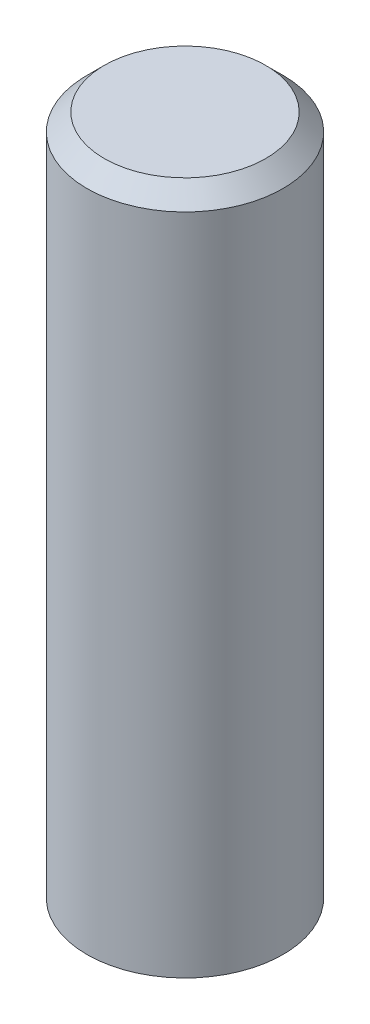
ISO-10303-21;
HEADER;
FILE_DESCRIPTION(('STEP AP214'),'2;1');
FILE_NAME('part.step','',(''),(''),'','','');
FILE_SCHEMA(('AUTOMOTIVE_DESIGN { 1 0 10303 214 1 1 1 1 }'));
ENDSEC;
DATA;
#1=APPLICATION_CONTEXT('core data for automotive mechanical design processes');
#2=APPLICATION_PROTOCOL_DEFINITION('international standard','automotive_design',2000,#1);
#3=PRODUCT_CONTEXT('',#1,'mechanical');
#4=PRODUCT('Part','Part','',(#3));
#5=PRODUCT_RELATED_PRODUCT_CATEGORY('part','',(#4));
#6=PRODUCT_DEFINITION_FORMATION('','',#4);
#7=PRODUCT_DEFINITION_CONTEXT('part definition',#1,'design');
#8=PRODUCT_DEFINITION('design','',#6,#7);
#9=PRODUCT_DEFINITION_SHAPE('','',#8);
#10=(LENGTH_UNIT() NAMED_UNIT(*) SI_UNIT(.MILLI.,.METRE.));
#11=(NAMED_UNIT(*) PLANE_ANGLE_UNIT() SI_UNIT($,.RADIAN.));
#12=(NAMED_UNIT(*) SI_UNIT($,.STERADIAN.) SOLID_ANGLE_UNIT());
#13=UNCERTAINTY_MEASURE_WITH_UNIT(LENGTH_MEASURE(1.E-05),#10,'distance_accuracy_value','');
#14=(GEOMETRIC_REPRESENTATION_CONTEXT(3) GLOBAL_UNCERTAINTY_ASSIGNED_CONTEXT((#13)) GLOBAL_UNIT_ASSIGNED_CONTEXT((#10,
#11,#12)) REPRESENTATION_CONTEXT('',''));
#15=CARTESIAN_POINT('',(0.,0.,0.));
#16=DIRECTION('',(0.,0.,1.));
#17=DIRECTION('',(1.,0.,0.));
#18=AXIS2_PLACEMENT_3D('',#15,#16,#17);
#19=CARTESIAN_POINT('',(0.,0.,0.));
#20=DIRECTION('',(0.,1.,0.));
#21=DIRECTION('',(0.,0.,1.));
#22=AXIS2_PLACEMENT_3D('',#19,#20,#21);
#23=CYLINDRICAL_SURFACE('',#22,1.7);
#24=CARTESIAN_POINT('',(0.,0.,0.));
#25=DIRECTION('',(0.,1.,0.));
#26=DIRECTION('',(0.,0.,1.));
#27=AXIS2_PLACEMENT_3D('',#24,#25,#26);
#28=CIRCLE('',#27,1.7);
#29=CARTESIAN_POINT('',(0.,0.,1.7));
#30=VERTEX_POINT('',#29);
#31=EDGE_CURVE('E10',#30,#30,#28,.T.);
#32=ORIENTED_EDGE('',*,*,#31,.T.);
#33=EDGE_LOOP('',(#32));
#34=FACE_BOUND('',#33,.T.);
#35=CARTESIAN_POINT('',(0.,11.5,0.));
#36=DIRECTION('',(0.,1.,0.));
#37=DIRECTION('',(0.,0.,1.));
#38=AXIS2_PLACEMENT_3D('',#35,#36,#37);
#39=CIRCLE('',#38,1.7);
#40=CARTESIAN_POINT('',(0.,11.5,1.7));
#41=VERTEX_POINT('',#40);
#42=EDGE_CURVE('E47',#41,#41,#39,.T.);
#43=ORIENTED_EDGE('',*,*,#42,.F.);
#44=EDGE_LOOP('',(#43));
#45=FACE_BOUND('',#44,.T.);
#46=ADVANCED_FACE('F39',(#34,#45),#23,.T.);
#47=CARTESIAN_POINT('',(1.7,0.,0.));
#48=DIRECTION('',(0.,-1.,0.));
#49=DIRECTION('',(0.,0.,-1.));
#50=AXIS2_PLACEMENT_3D('',#47,#48,#49);
#51=PLANE('',#50);
#52=ORIENTED_EDGE('',*,*,#31,.F.);
#53=EDGE_LOOP('',(#52));
#54=FACE_BOUND('',#53,.T.);
#55=ADVANCED_FACE('F58',(#54),#51,.T.);
#56=CARTESIAN_POINT('',(0.,11.8,0.));
#57=DIRECTION('',(0.,1.,0.));
#58=DIRECTION('',(0.,0.,1.));
#59=AXIS2_PLACEMENT_3D('',#56,#57,#58);
#60=PLANE('',#59);
#61=CARTESIAN_POINT('',(0.,11.8,0.));
#62=DIRECTION('',(0.,1.,0.));
#63=DIRECTION('',(0.,0.,1.));
#64=AXIS2_PLACEMENT_3D('',#61,#62,#63);
#65=CIRCLE('',#64,1.4);
#66=CARTESIAN_POINT('',(0.,11.8,1.4));
#67=VERTEX_POINT('',#66);
#68=EDGE_CURVE('E44',#67,#67,#65,.T.);
#69=ORIENTED_EDGE('',*,*,#68,.T.);
#70=EDGE_LOOP('',(#69));
#71=FACE_BOUND('',#70,.T.);
#72=ADVANCED_FACE('F61',(#71),#60,.T.);
#73=CARTESIAN_POINT('',(0.,11.8,0.));
#74=DIRECTION('',(0.,-1.,0.));
#75=DIRECTION('',(0.,0.,-1.));
#76=AXIS2_PLACEMENT_3D('',#73,#74,#75);
#77=CONICAL_SURFACE('',#76,1.4,0.785398163397448);
#78=ORIENTED_EDGE('',*,*,#42,.T.);
#79=EDGE_LOOP('',(#78));
#80=FACE_BOUND('',#79,.T.);
#81=ORIENTED_EDGE('',*,*,#68,.F.);
#82=EDGE_LOOP('',(#81));
#83=FACE_BOUND('',#82,.T.);
#84=ADVANCED_FACE('F57',(#80,#83),#77,.T.);
#85=CLOSED_SHELL('',(#46,#55,#72,#84));
#86=MANIFOLD_SOLID_BREP('B2',#85);
#87=ADVANCED_BREP_SHAPE_REPRESENTATION('',(#18,#86),#14);
#88=SHAPE_DEFINITION_REPRESENTATION(#9,#87);
ENDSEC;
END-ISO-10303-21;
